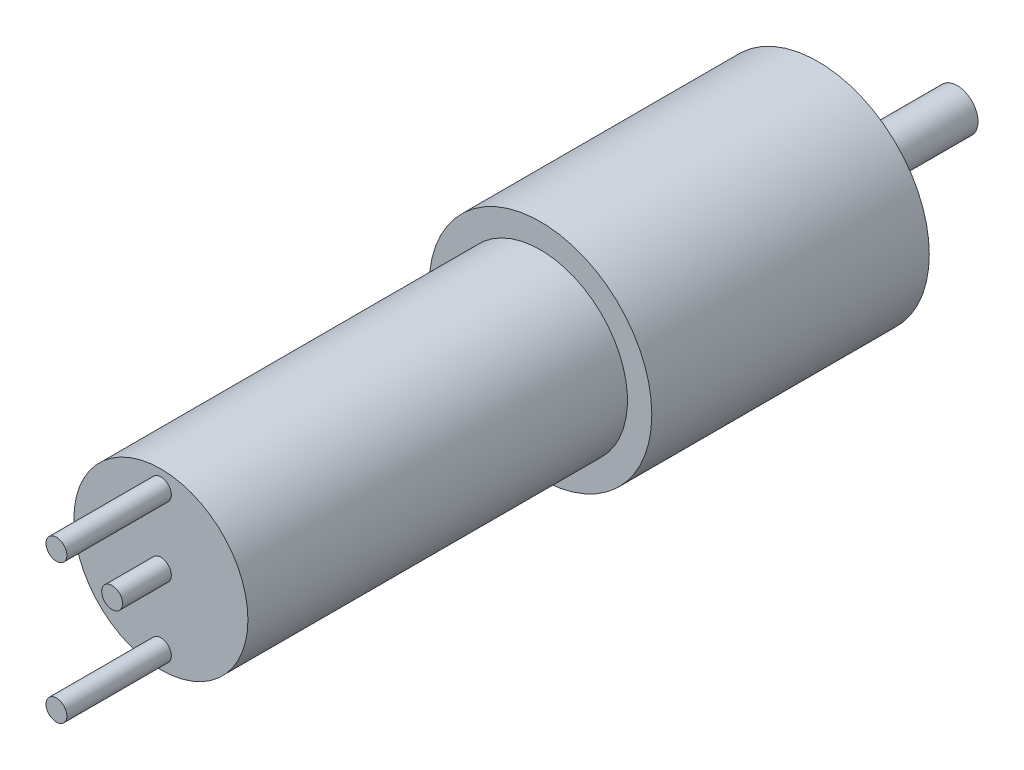
ISO-10303-21;
HEADER;
FILE_DESCRIPTION(('STEP AP214'),'2;1');
FILE_NAME('part.step','',(''),(''),'','','');
FILE_SCHEMA(('AUTOMOTIVE_DESIGN { 1 0 10303 214 1 1 1 1 }'));
ENDSEC;
DATA;
#1=APPLICATION_CONTEXT('core data for automotive mechanical design processes');
#2=APPLICATION_PROTOCOL_DEFINITION('international standard','automotive_design',2000,#1);
#3=PRODUCT_CONTEXT('',#1,'mechanical');
#4=PRODUCT('Part','Part','',(#3));
#5=PRODUCT_RELATED_PRODUCT_CATEGORY('part','',(#4));
#6=PRODUCT_DEFINITION_FORMATION('','',#4);
#7=PRODUCT_DEFINITION_CONTEXT('part definition',#1,'design');
#8=PRODUCT_DEFINITION('design','',#6,#7);
#9=PRODUCT_DEFINITION_SHAPE('','',#8);
#10=(LENGTH_UNIT() NAMED_UNIT(*) SI_UNIT(.MILLI.,.METRE.));
#11=(NAMED_UNIT(*) PLANE_ANGLE_UNIT() SI_UNIT($,.RADIAN.));
#12=(NAMED_UNIT(*) SI_UNIT($,.STERADIAN.) SOLID_ANGLE_UNIT());
#13=UNCERTAINTY_MEASURE_WITH_UNIT(LENGTH_MEASURE(1.E-05),#10,'distance_accuracy_value','');
#14=(GEOMETRIC_REPRESENTATION_CONTEXT(3) GLOBAL_UNCERTAINTY_ASSIGNED_CONTEXT((#13)) GLOBAL_UNIT_ASSIGNED_CONTEXT((#10,
#11,#12)) REPRESENTATION_CONTEXT('',''));
#15=CARTESIAN_POINT('',(0.,0.,0.));
#16=DIRECTION('',(0.,0.,1.));
#17=DIRECTION('',(1.,0.,0.));
#18=AXIS2_PLACEMENT_3D('',#15,#16,#17);
#19=CARTESIAN_POINT('',(0.,0.,54.5));
#20=DIRECTION('',(0.,0.,-1.));
#21=DIRECTION('',(-1.,0.,0.));
#22=AXIS2_PLACEMENT_3D('',#19,#20,#21);
#23=CYLINDRICAL_SURFACE('',#22,12.5);
#24=CARTESIAN_POINT('',(0.,0.,54.5));
#25=DIRECTION('',(0.,0.,1.));
#26=DIRECTION('',(1.,0.,0.));
#27=AXIS2_PLACEMENT_3D('',#24,#25,#26);
#28=CIRCLE('',#27,12.5);
#29=CARTESIAN_POINT('',(12.5,0.,54.5));
#30=VERTEX_POINT('',#29);
#31=EDGE_CURVE('E10',#30,#30,#28,.T.);
#32=ORIENTED_EDGE('',*,*,#31,.F.);
#33=EDGE_LOOP('',(#32));
#34=FACE_BOUND('',#33,.T.);
#35=CARTESIAN_POINT('',(0.,0.,0.));
#36=DIRECTION('',(0.,0.,-1.));
#37=DIRECTION('',(-1.,0.,0.));
#38=AXIS2_PLACEMENT_3D('',#35,#36,#37);
#39=CIRCLE('',#38,12.5);
#40=CARTESIAN_POINT('',(-12.5,0.,0.));
#41=VERTEX_POINT('',#40);
#42=EDGE_CURVE('E46',#41,#41,#39,.T.);
#43=ORIENTED_EDGE('',*,*,#42,.F.);
#44=EDGE_LOOP('',(#43));
#45=FACE_BOUND('',#44,.T.);
#46=ADVANCED_FACE('F31',(#34,#45),#23,.T.);
#47=CARTESIAN_POINT('',(0.,0.,54.5));
#48=DIRECTION('',(0.,0.,1.));
#49=DIRECTION('',(1.,0.,0.));
#50=AXIS2_PLACEMENT_3D('',#47,#48,#49);
#51=PLANE('',#50);
#52=CARTESIAN_POINT('',(0.,-10.,54.5));
#53=DIRECTION('',(0.,0.,1.));
#54=DIRECTION('',(1.,0.,0.));
#55=AXIS2_PLACEMENT_3D('',#52,#53,#54);
#56=CIRCLE('',#55,1.5);
#57=CARTESIAN_POINT('',(1.5,-10.,54.5));
#58=VERTEX_POINT('',#57);
#59=EDGE_CURVE('E75',#58,#58,#56,.T.);
#60=ORIENTED_EDGE('',*,*,#59,.F.);
#61=EDGE_LOOP('',(#60));
#62=FACE_BOUND('',#61,.T.);
#63=CARTESIAN_POINT('',(0.,10.,54.5));
#64=DIRECTION('',(0.,0.,1.));
#65=DIRECTION('',(1.,0.,0.));
#66=AXIS2_PLACEMENT_3D('',#63,#64,#65);
#67=CIRCLE('',#66,1.5);
#68=CARTESIAN_POINT('',(1.5,10.,54.5));
#69=VERTEX_POINT('',#68);
#70=EDGE_CURVE('E69',#69,#69,#67,.T.);
#71=ORIENTED_EDGE('',*,*,#70,.F.);
#72=EDGE_LOOP('',(#71));
#73=FACE_BOUND('',#72,.T.);
#74=CARTESIAN_POINT('',(0.,0.,54.5));
#75=DIRECTION('',(0.,0.,1.));
#76=DIRECTION('',(1.,0.,0.));
#77=AXIS2_PLACEMENT_3D('',#74,#75,#76);
#78=CIRCLE('',#77,1.5);
#79=CARTESIAN_POINT('',(1.5,0.,54.5));
#80=VERTEX_POINT('',#79);
#81=EDGE_CURVE('E41',#80,#80,#78,.T.);
#82=ORIENTED_EDGE('',*,*,#81,.F.);
#83=EDGE_LOOP('',(#82));
#84=FACE_BOUND('',#83,.T.);
#85=ORIENTED_EDGE('',*,*,#31,.T.);
#86=EDGE_LOOP('',(#85));
#87=FACE_BOUND('',#86,.T.);
#88=ADVANCED_FACE('F90',(#62,#73,#84,#87),#51,.T.);
#89=CARTESIAN_POINT('',(0.,0.,61.5));
#90=DIRECTION('',(0.,0.,-1.));
#91=DIRECTION('',(-1.,0.,0.));
#92=AXIS2_PLACEMENT_3D('',#89,#90,#91);
#93=CYLINDRICAL_SURFACE('',#92,1.5);
#94=CARTESIAN_POINT('',(0.,0.,61.5));
#95=DIRECTION('',(0.,0.,1.));
#96=DIRECTION('',(1.,0.,0.));
#97=AXIS2_PLACEMENT_3D('',#94,#95,#96);
#98=CIRCLE('',#97,1.5);
#99=CARTESIAN_POINT('',(1.5,0.,61.5));
#100=VERTEX_POINT('',#99);
#101=EDGE_CURVE('E37',#100,#100,#98,.T.);
#102=ORIENTED_EDGE('',*,*,#101,.F.);
#103=EDGE_LOOP('',(#102));
#104=FACE_BOUND('',#103,.T.);
#105=ORIENTED_EDGE('',*,*,#81,.T.);
#106=EDGE_LOOP('',(#105));
#107=FACE_BOUND('',#106,.T.);
#108=ADVANCED_FACE('F93',(#104,#107),#93,.T.);
#109=CARTESIAN_POINT('',(0.,0.,61.5));
#110=DIRECTION('',(0.,0.,1.));
#111=DIRECTION('',(1.,0.,0.));
#112=AXIS2_PLACEMENT_3D('',#109,#110,#111);
#113=PLANE('',#112);
#114=ORIENTED_EDGE('',*,*,#101,.T.);
#115=EDGE_LOOP('',(#114));
#116=FACE_BOUND('',#115,.T.);
#117=ADVANCED_FACE('F99',(#116),#113,.T.);
#118=CARTESIAN_POINT('',(0.,0.,-39.85));
#119=DIRECTION('',(0.,0.,1.));
#120=DIRECTION('',(1.,0.,0.));
#121=AXIS2_PLACEMENT_3D('',#118,#119,#120);
#122=CYLINDRICAL_SURFACE('',#121,16.);
#123=CARTESIAN_POINT('',(0.,0.,-39.85));
#124=DIRECTION('',(0.,0.,-1.));
#125=DIRECTION('',(-1.,0.,0.));
#126=AXIS2_PLACEMENT_3D('',#123,#124,#125);
#127=CIRCLE('',#126,16.);
#128=CARTESIAN_POINT('',(-16.,0.,-39.85));
#129=VERTEX_POINT('',#128);
#130=EDGE_CURVE('E50',#129,#129,#127,.T.);
#131=ORIENTED_EDGE('',*,*,#130,.F.);
#132=EDGE_LOOP('',(#131));
#133=FACE_BOUND('',#132,.T.);
#134=CARTESIAN_POINT('',(0.,0.,0.));
#135=DIRECTION('',(0.,0.,-1.));
#136=DIRECTION('',(-1.,0.,0.));
#137=AXIS2_PLACEMENT_3D('',#134,#135,#136);
#138=CIRCLE('',#137,16.);
#139=CARTESIAN_POINT('',(-16.,0.,0.));
#140=VERTEX_POINT('',#139);
#141=EDGE_CURVE('E51',#140,#140,#138,.T.);
#142=ORIENTED_EDGE('',*,*,#141,.T.);
#143=EDGE_LOOP('',(#142));
#144=FACE_BOUND('',#143,.T.);
#145=ADVANCED_FACE('F106',(#133,#144),#122,.T.);
#146=CARTESIAN_POINT('',(0.,0.,-39.85));
#147=DIRECTION('',(0.,0.,-1.));
#148=DIRECTION('',(-1.,0.,0.));
#149=AXIS2_PLACEMENT_3D('',#146,#147,#148);
#150=PLANE('',#149);
#151=CARTESIAN_POINT('',(0.,0.,-39.85));
#152=DIRECTION('',(0.,0.,-1.));
#153=DIRECTION('',(-1.,0.,0.));
#154=AXIS2_PLACEMENT_3D('',#151,#152,#153);
#155=CIRCLE('',#154,10.);
#156=CARTESIAN_POINT('',(-10.,0.,-39.85));
#157=VERTEX_POINT('',#156);
#158=EDGE_CURVE('E57',#157,#157,#155,.T.);
#159=ORIENTED_EDGE('',*,*,#158,.F.);
#160=EDGE_LOOP('',(#159));
#161=FACE_BOUND('',#160,.T.);
#162=ORIENTED_EDGE('',*,*,#130,.T.);
#163=EDGE_LOOP('',(#162));
#164=FACE_BOUND('',#163,.T.);
#165=ADVANCED_FACE('F119',(#161,#164),#150,.T.);
#166=CARTESIAN_POINT('',(0.,0.,0.));
#167=DIRECTION('',(0.,0.,-1.));
#168=DIRECTION('',(-1.,0.,0.));
#169=AXIS2_PLACEMENT_3D('',#166,#167,#168);
#170=PLANE('',#169);
#171=ORIENTED_EDGE('',*,*,#42,.T.);
#172=EDGE_LOOP('',(#171));
#173=FACE_BOUND('',#172,.T.);
#174=ORIENTED_EDGE('',*,*,#141,.F.);
#175=EDGE_LOOP('',(#174));
#176=FACE_BOUND('',#175,.T.);
#177=ADVANCED_FACE('F115',(#173,#176),#170,.F.);
#178=CARTESIAN_POINT('',(0.,0.,-42.85));
#179=DIRECTION('',(0.,0.,1.));
#180=DIRECTION('',(1.,0.,0.));
#181=AXIS2_PLACEMENT_3D('',#178,#179,#180);
#182=CYLINDRICAL_SURFACE('',#181,10.);
#183=CARTESIAN_POINT('',(0.,0.,-42.85));
#184=DIRECTION('',(0.,0.,-1.));
#185=DIRECTION('',(-1.,0.,0.));
#186=AXIS2_PLACEMENT_3D('',#183,#184,#185);
#187=CIRCLE('',#186,10.);
#188=CARTESIAN_POINT('',(-10.,0.,-42.85));
#189=VERTEX_POINT('',#188);
#190=EDGE_CURVE('E54',#189,#189,#187,.T.);
#191=ORIENTED_EDGE('',*,*,#190,.F.);
#192=EDGE_LOOP('',(#191));
#193=FACE_BOUND('',#192,.T.);
#194=ORIENTED_EDGE('',*,*,#158,.T.);
#195=EDGE_LOOP('',(#194));
#196=FACE_BOUND('',#195,.T.);
#197=ADVANCED_FACE('F118',(#193,#196),#182,.T.);
#198=CARTESIAN_POINT('',(0.,0.,-42.85));
#199=DIRECTION('',(0.,0.,-1.));
#200=DIRECTION('',(-1.,0.,0.));
#201=AXIS2_PLACEMENT_3D('',#198,#199,#200);
#202=PLANE('',#201);
#203=CARTESIAN_POINT('',(0.,0.,-42.85));
#204=DIRECTION('',(0.,0.,-1.));
#205=DIRECTION('',(-1.,0.,0.));
#206=AXIS2_PLACEMENT_3D('',#203,#204,#205);
#207=CIRCLE('',#206,3.);
#208=CARTESIAN_POINT('',(-3.,0.,-42.85));
#209=VERTEX_POINT('',#208);
#210=EDGE_CURVE('E63',#209,#209,#207,.T.);
#211=ORIENTED_EDGE('',*,*,#210,.F.);
#212=EDGE_LOOP('',(#211));
#213=FACE_BOUND('',#212,.T.);
#214=ORIENTED_EDGE('',*,*,#190,.T.);
#215=EDGE_LOOP('',(#214));
#216=FACE_BOUND('',#215,.T.);
#217=ADVANCED_FACE('F135',(#213,#216),#202,.T.);
#218=CARTESIAN_POINT('',(0.,0.,-59.85));
#219=DIRECTION('',(0.,0.,1.));
#220=DIRECTION('',(1.,0.,0.));
#221=AXIS2_PLACEMENT_3D('',#218,#219,#220);
#222=CYLINDRICAL_SURFACE('',#221,3.);
#223=CARTESIAN_POINT('',(0.,0.,-59.85));
#224=DIRECTION('',(0.,0.,-1.));
#225=DIRECTION('',(-1.,0.,0.));
#226=AXIS2_PLACEMENT_3D('',#223,#224,#225);
#227=CIRCLE('',#226,3.);
#228=CARTESIAN_POINT('',(-3.,0.,-59.85));
#229=VERTEX_POINT('',#228);
#230=EDGE_CURVE('E60',#229,#229,#227,.T.);
#231=ORIENTED_EDGE('',*,*,#230,.F.);
#232=EDGE_LOOP('',(#231));
#233=FACE_BOUND('',#232,.T.);
#234=ORIENTED_EDGE('',*,*,#210,.T.);
#235=EDGE_LOOP('',(#234));
#236=FACE_BOUND('',#235,.T.);
#237=ADVANCED_FACE('F139',(#233,#236),#222,.T.);
#238=CARTESIAN_POINT('',(0.,0.,-59.85));
#239=DIRECTION('',(0.,0.,-1.));
#240=DIRECTION('',(-1.,0.,0.));
#241=AXIS2_PLACEMENT_3D('',#238,#239,#240);
#242=PLANE('',#241);
#243=ORIENTED_EDGE('',*,*,#230,.T.);
#244=EDGE_LOOP('',(#243));
#245=FACE_BOUND('',#244,.T.);
#246=ADVANCED_FACE('F143',(#245),#242,.T.);
#247=CARTESIAN_POINT('',(0.,10.,69.5));
#248=DIRECTION('',(0.,0.,-1.));
#249=DIRECTION('',(-1.,0.,0.));
#250=AXIS2_PLACEMENT_3D('',#247,#248,#249);
#251=CYLINDRICAL_SURFACE('',#250,1.5);
#252=CARTESIAN_POINT('',(0.,10.,69.5));
#253=DIRECTION('',(0.,0.,1.));
#254=DIRECTION('',(1.,0.,0.));
#255=AXIS2_PLACEMENT_3D('',#252,#253,#254);
#256=CIRCLE('',#255,1.5);
#257=CARTESIAN_POINT('',(1.5,10.,69.5));
#258=VERTEX_POINT('',#257);
#259=EDGE_CURVE('E66',#258,#258,#256,.T.);
#260=ORIENTED_EDGE('',*,*,#259,.F.);
#261=EDGE_LOOP('',(#260));
#262=FACE_BOUND('',#261,.T.);
#263=ORIENTED_EDGE('',*,*,#70,.T.);
#264=EDGE_LOOP('',(#263));
#265=FACE_BOUND('',#264,.T.);
#266=ADVANCED_FACE('F147',(#262,#265),#251,.T.);
#267=CARTESIAN_POINT('',(0.,10.,69.5));
#268=DIRECTION('',(0.,0.,1.));
#269=DIRECTION('',(1.,0.,0.));
#270=AXIS2_PLACEMENT_3D('',#267,#268,#269);
#271=PLANE('',#270);
#272=ORIENTED_EDGE('',*,*,#259,.T.);
#273=EDGE_LOOP('',(#272));
#274=FACE_BOUND('',#273,.T.);
#275=ADVANCED_FACE('F86',(#274),#271,.T.);
#276=CARTESIAN_POINT('',(0.,-10.,69.5));
#277=DIRECTION('',(0.,0.,-1.));
#278=DIRECTION('',(-1.,0.,0.));
#279=AXIS2_PLACEMENT_3D('',#276,#277,#278);
#280=CYLINDRICAL_SURFACE('',#279,1.5);
#281=CARTESIAN_POINT('',(0.,-10.,69.5));
#282=DIRECTION('',(0.,0.,1.));
#283=DIRECTION('',(1.,0.,0.));
#284=AXIS2_PLACEMENT_3D('',#281,#282,#283);
#285=CIRCLE('',#284,1.5);
#286=CARTESIAN_POINT('',(1.5,-10.,69.5));
#287=VERTEX_POINT('',#286);
#288=EDGE_CURVE('E72',#287,#287,#285,.T.);
#289=ORIENTED_EDGE('',*,*,#288,.F.);
#290=EDGE_LOOP('',(#289));
#291=FACE_BOUND('',#290,.T.);
#292=ORIENTED_EDGE('',*,*,#59,.T.);
#293=EDGE_LOOP('',(#292));
#294=FACE_BOUND('',#293,.T.);
#295=ADVANCED_FACE('F83',(#291,#294),#280,.T.);
#296=CARTESIAN_POINT('',(0.,-10.,69.5));
#297=DIRECTION('',(0.,0.,1.));
#298=DIRECTION('',(1.,0.,0.));
#299=AXIS2_PLACEMENT_3D('',#296,#297,#298);
#300=PLANE('',#299);
#301=ORIENTED_EDGE('',*,*,#288,.T.);
#302=EDGE_LOOP('',(#301));
#303=FACE_BOUND('',#302,.T.);
#304=ADVANCED_FACE('F81',(#303),#300,.T.);
#305=CLOSED_SHELL('',(#46,#88,#108,#117,#145,#165,#177,#197,#217,#237,#246,#266,#275,#295,#304));
#306=MANIFOLD_SOLID_BREP('B2',#305);
#307=ADVANCED_BREP_SHAPE_REPRESENTATION('',(#18,#306),#14);
#308=SHAPE_DEFINITION_REPRESENTATION(#9,#307);
ENDSEC;
END-ISO-10303-21;
